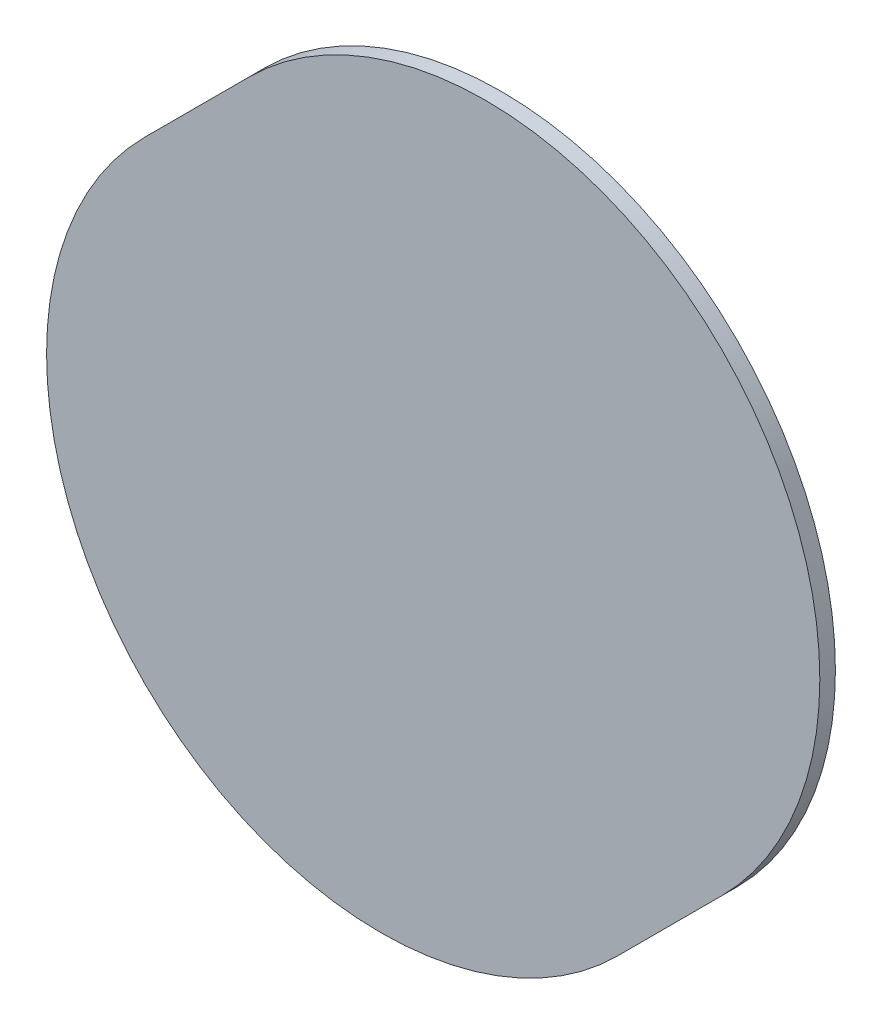
ISO-10303-21;
HEADER;
FILE_DESCRIPTION(('STEP AP214'),'2;1');
FILE_NAME('part.step','',(''),(''),'','','');
FILE_SCHEMA(('AUTOMOTIVE_DESIGN { 1 0 10303 214 1 1 1 1 }'));
ENDSEC;
DATA;
#1=APPLICATION_CONTEXT('core data for automotive mechanical design processes');
#2=APPLICATION_PROTOCOL_DEFINITION('international standard','automotive_design',2000,#1);
#3=PRODUCT_CONTEXT('',#1,'mechanical');
#4=PRODUCT('Part','Part','',(#3));
#5=PRODUCT_RELATED_PRODUCT_CATEGORY('part','',(#4));
#6=PRODUCT_DEFINITION_FORMATION('','',#4);
#7=PRODUCT_DEFINITION_CONTEXT('part definition',#1,'design');
#8=PRODUCT_DEFINITION('design','',#6,#7);
#9=PRODUCT_DEFINITION_SHAPE('','',#8);
#10=(LENGTH_UNIT() NAMED_UNIT(*) SI_UNIT(.MILLI.,.METRE.));
#11=(NAMED_UNIT(*) PLANE_ANGLE_UNIT() SI_UNIT($,.RADIAN.));
#12=(NAMED_UNIT(*) SI_UNIT($,.STERADIAN.) SOLID_ANGLE_UNIT());
#13=UNCERTAINTY_MEASURE_WITH_UNIT(LENGTH_MEASURE(1.E-05),#10,'distance_accuracy_value','');
#14=(GEOMETRIC_REPRESENTATION_CONTEXT(3) GLOBAL_UNCERTAINTY_ASSIGNED_CONTEXT((#13)) GLOBAL_UNIT_ASSIGNED_CONTEXT((#10,
#11,#12)) REPRESENTATION_CONTEXT('',''));
#15=CARTESIAN_POINT('',(0.,0.,0.));
#16=DIRECTION('',(0.,0.,1.));
#17=DIRECTION('',(1.,0.,0.));
#18=AXIS2_PLACEMENT_3D('',#15,#16,#17);
#19=CARTESIAN_POINT('',(11.954669,-5.984669,1.635));
#20=DIRECTION('',(0.,0.,1.));
#21=DIRECTION('',(1.,0.,0.));
#22=AXIS2_PLACEMENT_3D('',#19,#20,#21);
#23=PLANE('',#22);
#24=DIRECTION('',(-0.707106781186548,-0.707106781186548,0.));
#25=VECTOR('',#24,1.);
#26=CARTESIAN_POINT('',(11.954669,-5.984669,1.635));
#27=LINE('',#26,#25);
#28=CARTESIAN_POINT('',(11.954669,-5.984669,1.635));
#29=VERTEX_POINT('',#28);
#30=CARTESIAN_POINT('',(11.719669,-6.219669,1.635));
#31=VERTEX_POINT('',#30);
#32=EDGE_CURVE('E64',#29,#31,#27,.T.);
#33=ORIENTED_EDGE('',*,*,#32,.T.);
#34=CARTESIAN_POINT('',(12.2499995,-6.7499995,1.635));
#35=DIRECTION('',(0.,0.,1.));
#36=DIRECTION('',(-0.707106781186548,0.707106781186548,0.));
#37=AXIS2_PLACEMENT_3D('',#34,#35,#36);
#38=CIRCLE('',#37,0.75000058564);
#39=CARTESIAN_POINT('',(12.78033,-7.28033,1.635));
#40=VERTEX_POINT('',#39);
#41=EDGE_CURVE('E93',#31,#40,#38,.T.);
#42=ORIENTED_EDGE('',*,*,#41,.T.);
#43=DIRECTION('',(0.707106781186548,0.707106781186548,0.));
#44=VECTOR('',#43,1.);
#45=CARTESIAN_POINT('',(12.78033,-7.28033,1.635));
#46=LINE('',#45,#44);
#47=CARTESIAN_POINT('',(13.01533,-7.04533,1.635));
#48=VERTEX_POINT('',#47);
#49=EDGE_CURVE('E67',#40,#48,#46,.T.);
#50=ORIENTED_EDGE('',*,*,#49,.T.);
#51=CARTESIAN_POINT('',(12.4849995,-6.5149995,1.635));
#52=DIRECTION('',(0.,0.,1.));
#53=DIRECTION('',(0.707106781186548,-0.707106781186548,0.));
#54=AXIS2_PLACEMENT_3D('',#51,#52,#53);
#55=CIRCLE('',#54,0.75000058564);
#56=EDGE_CURVE('E11',#48,#29,#55,.T.);
#57=ORIENTED_EDGE('',*,*,#56,.T.);
#58=EDGE_LOOP('',(#33,#42,#50,#57));
#59=FACE_BOUND('',#58,.T.);
#60=ADVANCED_FACE('F16',(#59),#23,.T.);
#61=CARTESIAN_POINT('',(11.954669,-5.984669,1.6));
#62=DIRECTION('',(0.,0.,1.));
#63=DIRECTION('',(1.,0.,0.));
#64=AXIS2_PLACEMENT_3D('',#61,#62,#63);
#65=PLANE('',#64);
#66=CARTESIAN_POINT('',(12.4849995,-6.5149995,1.6));
#67=DIRECTION('',(0.,0.,1.));
#68=DIRECTION('',(0.707106781186548,-0.707106781186548,0.));
#69=AXIS2_PLACEMENT_3D('',#66,#67,#68);
#70=CIRCLE('',#69,0.75000058564);
#71=CARTESIAN_POINT('',(13.01533,-7.04533,1.6));
#72=VERTEX_POINT('',#71);
#73=CARTESIAN_POINT('',(11.954669,-5.984669,1.6));
#74=VERTEX_POINT('',#73);
#75=EDGE_CURVE('E27',#72,#74,#70,.T.);
#76=ORIENTED_EDGE('',*,*,#75,.F.);
#77=DIRECTION('',(0.707106781186548,0.707106781186548,0.));
#78=VECTOR('',#77,1.);
#79=CARTESIAN_POINT('',(12.78033,-7.28033,1.6));
#80=LINE('',#79,#78);
#81=CARTESIAN_POINT('',(12.78033,-7.28033,1.6));
#82=VERTEX_POINT('',#81);
#83=EDGE_CURVE('E96',#82,#72,#80,.T.);
#84=ORIENTED_EDGE('',*,*,#83,.F.);
#85=CARTESIAN_POINT('',(12.2499995,-6.7499995,1.6));
#86=DIRECTION('',(0.,0.,1.));
#87=DIRECTION('',(-0.707106781186548,0.707106781186548,0.));
#88=AXIS2_PLACEMENT_3D('',#85,#86,#87);
#89=CIRCLE('',#88,0.75000058564);
#90=CARTESIAN_POINT('',(11.719669,-6.219669,1.6));
#91=VERTEX_POINT('',#90);
#92=EDGE_CURVE('E76',#91,#82,#89,.T.);
#93=ORIENTED_EDGE('',*,*,#92,.F.);
#94=DIRECTION('',(-0.707106781186548,-0.707106781186548,0.));
#95=VECTOR('',#94,1.);
#96=CARTESIAN_POINT('',(11.954669,-5.984669,1.6));
#97=LINE('',#96,#95);
#98=EDGE_CURVE('E20',#74,#91,#97,.T.);
#99=ORIENTED_EDGE('',*,*,#98,.F.);
#100=EDGE_LOOP('',(#76,#84,#93,#99));
#101=FACE_BOUND('',#100,.T.);
#102=ADVANCED_FACE('F114',(#101),#65,.F.);
#103=CARTESIAN_POINT('',(12.4849995,-6.5149995,1.6));
#104=DIRECTION('',(0.,0.,-1.));
#105=DIRECTION('',(0.707106781186548,-0.707106781186548,0.));
#106=AXIS2_PLACEMENT_3D('',#103,#104,#105);
#107=CYLINDRICAL_SURFACE('',#106,0.75000058564);
#108=ORIENTED_EDGE('',*,*,#75,.T.);
#109=DIRECTION('',(0.,0.,1.));
#110=VECTOR('',#109,1.);
#111=CARTESIAN_POINT('',(11.954669,-5.984669,1.6));
#112=LINE('',#111,#110);
#113=EDGE_CURVE('E70',#74,#29,#112,.T.);
#114=ORIENTED_EDGE('',*,*,#113,.T.);
#115=ORIENTED_EDGE('',*,*,#56,.F.);
#116=DIRECTION('',(0.,0.,1.));
#117=VECTOR('',#116,1.);
#118=CARTESIAN_POINT('',(13.01533,-7.04533,1.6));
#119=LINE('',#118,#117);
#120=EDGE_CURVE('E101',#72,#48,#119,.T.);
#121=ORIENTED_EDGE('',*,*,#120,.F.);
#122=EDGE_LOOP('',(#108,#114,#115,#121));
#123=FACE_BOUND('',#122,.T.);
#124=ADVANCED_FACE('F71',(#123),#107,.T.);
#125=CARTESIAN_POINT('',(12.78033,-7.28033,1.6));
#126=DIRECTION('',(-0.707106781186548,0.707106781186548,0.));
#127=DIRECTION('',(0.,0.,1.));
#128=AXIS2_PLACEMENT_3D('',#125,#126,#127);
#129=PLANE('',#128);
#130=ORIENTED_EDGE('',*,*,#83,.T.);
#131=ORIENTED_EDGE('',*,*,#120,.T.);
#132=ORIENTED_EDGE('',*,*,#49,.F.);
#133=DIRECTION('',(0.,0.,1.));
#134=VECTOR('',#133,1.);
#135=CARTESIAN_POINT('',(12.78033,-7.28033,1.6));
#136=LINE('',#135,#134);
#137=EDGE_CURVE('E90',#82,#40,#136,.T.);
#138=ORIENTED_EDGE('',*,*,#137,.F.);
#139=EDGE_LOOP('',(#130,#131,#132,#138));
#140=FACE_BOUND('',#139,.T.);
#141=ADVANCED_FACE('F109',(#140),#129,.F.);
#142=CARTESIAN_POINT('',(12.2499995,-6.7499995,1.6));
#143=DIRECTION('',(0.,0.,-1.));
#144=DIRECTION('',(-0.707106781186548,0.707106781186548,0.));
#145=AXIS2_PLACEMENT_3D('',#142,#143,#144);
#146=CYLINDRICAL_SURFACE('',#145,0.75000058564);
#147=ORIENTED_EDGE('',*,*,#92,.T.);
#148=ORIENTED_EDGE('',*,*,#137,.T.);
#149=ORIENTED_EDGE('',*,*,#41,.F.);
#150=DIRECTION('',(0.,0.,1.));
#151=VECTOR('',#150,1.);
#152=CARTESIAN_POINT('',(11.719669,-6.219669,1.6));
#153=LINE('',#152,#151);
#154=EDGE_CURVE('E80',#91,#31,#153,.T.);
#155=ORIENTED_EDGE('',*,*,#154,.F.);
#156=EDGE_LOOP('',(#147,#148,#149,#155));
#157=FACE_BOUND('',#156,.T.);
#158=ADVANCED_FACE('F18',(#157),#146,.T.);
#159=CARTESIAN_POINT('',(11.954669,-5.984669,1.6));
#160=DIRECTION('',(0.707106781186548,-0.707106781186548,0.));
#161=DIRECTION('',(0.,0.,-1.));
#162=AXIS2_PLACEMENT_3D('',#159,#160,#161);
#163=PLANE('',#162);
#164=ORIENTED_EDGE('',*,*,#98,.T.);
#165=ORIENTED_EDGE('',*,*,#154,.T.);
#166=ORIENTED_EDGE('',*,*,#32,.F.);
#167=ORIENTED_EDGE('',*,*,#113,.F.);
#168=EDGE_LOOP('',(#164,#165,#166,#167));
#169=FACE_BOUND('',#168,.T.);
#170=ADVANCED_FACE('F78',(#169),#163,.F.);
#171=CLOSED_SHELL('',(#60,#102,#124,#141,#158,#170));
#172=MANIFOLD_SOLID_BREP('B1',#171);
#173=ADVANCED_BREP_SHAPE_REPRESENTATION('',(#18,#172),#14);
#174=SHAPE_DEFINITION_REPRESENTATION(#9,#173);
ENDSEC;
END-ISO-10303-21;
